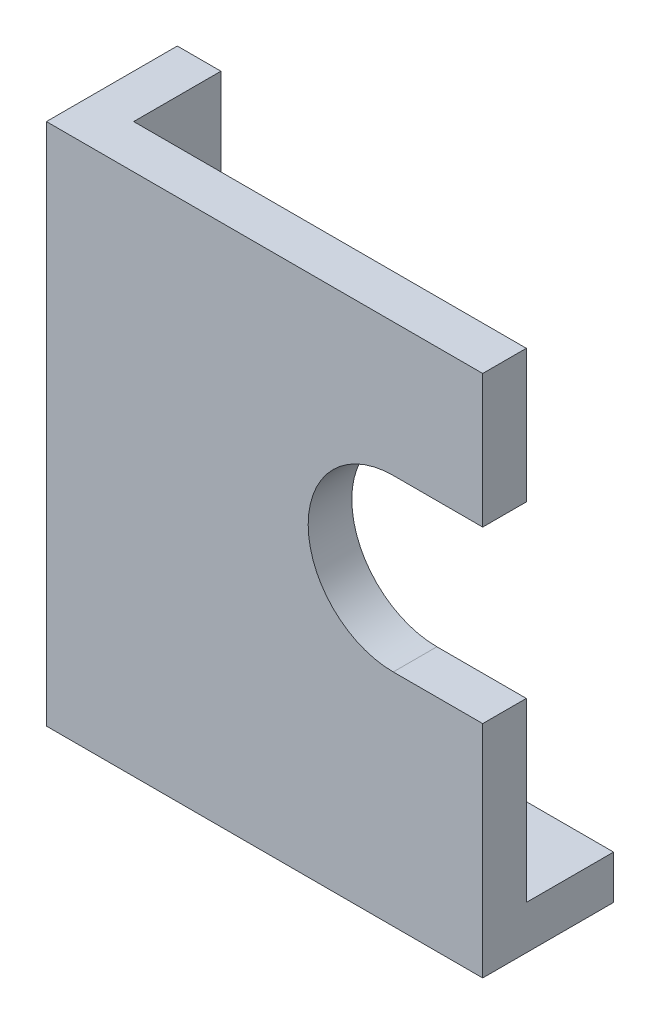
ISO-10303-21;
HEADER;
FILE_DESCRIPTION(('STEP AP214'),'2;1');
FILE_NAME('part.step','',(''),(''),'','','');
FILE_SCHEMA(('AUTOMOTIVE_DESIGN { 1 0 10303 214 1 1 1 1 }'));
ENDSEC;
DATA;
#1=APPLICATION_CONTEXT('core data for automotive mechanical design processes');
#2=APPLICATION_PROTOCOL_DEFINITION('international standard','automotive_design',2000,#1);
#3=PRODUCT_CONTEXT('',#1,'mechanical');
#4=PRODUCT('Part','Part','',(#3));
#5=PRODUCT_RELATED_PRODUCT_CATEGORY('part','',(#4));
#6=PRODUCT_DEFINITION_FORMATION('','',#4);
#7=PRODUCT_DEFINITION_CONTEXT('part definition',#1,'design');
#8=PRODUCT_DEFINITION('design','',#6,#7);
#9=PRODUCT_DEFINITION_SHAPE('','',#8);
#10=(LENGTH_UNIT() NAMED_UNIT(*) SI_UNIT(.MILLI.,.METRE.));
#11=(NAMED_UNIT(*) PLANE_ANGLE_UNIT() SI_UNIT($,.RADIAN.));
#12=(NAMED_UNIT(*) SI_UNIT($,.STERADIAN.) SOLID_ANGLE_UNIT());
#13=UNCERTAINTY_MEASURE_WITH_UNIT(LENGTH_MEASURE(1.E-05),#10,'distance_accuracy_value','');
#14=(GEOMETRIC_REPRESENTATION_CONTEXT(3) GLOBAL_UNCERTAINTY_ASSIGNED_CONTEXT((#13)) GLOBAL_UNIT_ASSIGNED_CONTEXT((#10,
#11,#12)) REPRESENTATION_CONTEXT('',''));
#15=CARTESIAN_POINT('',(0.,0.,0.));
#16=DIRECTION('',(0.,0.,1.));
#17=DIRECTION('',(1.,0.,0.));
#18=AXIS2_PLACEMENT_3D('',#15,#16,#17);
#19=CARTESIAN_POINT('',(60.,90.,-10.));
#20=DIRECTION('',(0.,0.,1.));
#21=DIRECTION('',(0.,-1.,0.));
#22=AXIS2_PLACEMENT_3D('',#19,#20,#21);
#23=PLANE('',#22);
#24=DIRECTION('',(0.,1.,0.));
#25=VECTOR('',#24,1.);
#26=CARTESIAN_POINT('',(55.,79.5,-10.));
#27=LINE('',#26,#25);
#28=CARTESIAN_POINT('',(55.,79.5,-10.));
#29=VERTEX_POINT('',#28);
#30=CARTESIAN_POINT('',(55.,110.,-10.));
#31=VERTEX_POINT('',#30);
#32=EDGE_CURVE('E52',#29,#31,#27,.T.);
#33=ORIENTED_EDGE('',*,*,#32,.F.);
#34=DIRECTION('',(1.,0.,0.));
#35=VECTOR('',#34,1.);
#36=CARTESIAN_POINT('',(34.5,79.5,-10.));
#37=LINE('',#36,#35);
#38=CARTESIAN_POINT('',(34.5,79.5,-10.));
#39=VERTEX_POINT('',#38);
#40=EDGE_CURVE('E193',#39,#29,#37,.T.);
#41=ORIENTED_EDGE('',*,*,#40,.F.);
#42=CARTESIAN_POINT('',(34.5,60.,-10.));
#43=DIRECTION('',(0.,0.,-1.));
#44=DIRECTION('',(0.,1.,0.));
#45=AXIS2_PLACEMENT_3D('',#42,#43,#44);
#46=CIRCLE('',#45,19.5);
#47=CARTESIAN_POINT('',(34.5,40.5,-10.));
#48=VERTEX_POINT('',#47);
#49=EDGE_CURVE('E180',#48,#39,#46,.T.);
#50=ORIENTED_EDGE('',*,*,#49,.F.);
#51=DIRECTION('',(-1.,0.,0.));
#52=VECTOR('',#51,1.);
#53=CARTESIAN_POINT('',(34.5,40.5,-10.));
#54=LINE('',#53,#52);
#55=CARTESIAN_POINT('',(55.,40.5,-10.));
#56=VERTEX_POINT('',#55);
#57=EDGE_CURVE('E185',#56,#48,#54,.T.);
#58=ORIENTED_EDGE('',*,*,#57,.F.);
#59=DIRECTION('',(0.,1.,0.));
#60=VECTOR('',#59,1.);
#61=CARTESIAN_POINT('',(55.,0.,-10.));
#62=LINE('',#61,#60);
#63=CARTESIAN_POINT('',(55.,0.,-10.));
#64=VERTEX_POINT('',#63);
#65=EDGE_CURVE('E60',#64,#56,#62,.T.);
#66=ORIENTED_EDGE('',*,*,#65,.F.);
#67=DIRECTION('',(-1.,0.,0.));
#68=VECTOR('',#67,1.);
#69=CARTESIAN_POINT('',(60.,0.,-10.));
#70=LINE('',#69,#68);
#71=CARTESIAN_POINT('',(-35.,0.,-10.));
#72=VERTEX_POINT('',#71);
#73=EDGE_CURVE('E45',#64,#72,#70,.T.);
#74=ORIENTED_EDGE('',*,*,#73,.T.);
#75=DIRECTION('',(0.,-1.,0.));
#76=VECTOR('',#75,1.);
#77=CARTESIAN_POINT('',(-35.,90.,-10.));
#78=LINE('',#77,#76);
#79=CARTESIAN_POINT('',(-35.,110.,-10.));
#80=VERTEX_POINT('',#79);
#81=EDGE_CURVE('E127',#80,#72,#78,.T.);
#82=ORIENTED_EDGE('',*,*,#81,.F.);
#83=DIRECTION('',(-1.,0.,0.));
#84=VECTOR('',#83,1.);
#85=CARTESIAN_POINT('',(60.,110.,-10.));
#86=LINE('',#85,#84);
#87=EDGE_CURVE('E170',#31,#80,#86,.T.);
#88=ORIENTED_EDGE('',*,*,#87,.F.);
#89=EDGE_LOOP('',(#33,#41,#50,#58,#66,#74,#82,#88));
#90=FACE_BOUND('',#89,.T.);
#91=ADVANCED_FACE('F37',(#90),#23,.F.);
#92=CARTESIAN_POINT('',(60.,-10.,0.));
#93=DIRECTION('',(0.,0.,-1.));
#94=DIRECTION('',(-1.,0.,0.));
#95=AXIS2_PLACEMENT_3D('',#92,#93,#94);
#96=PLANE('',#95);
#97=DIRECTION('',(0.,-1.,0.));
#98=VECTOR('',#97,1.);
#99=CARTESIAN_POINT('',(55.,110.,0.));
#100=LINE('',#99,#98);
#101=CARTESIAN_POINT('',(55.,110.,0.));
#102=VERTEX_POINT('',#101);
#103=CARTESIAN_POINT('',(55.,79.5,0.));
#104=VERTEX_POINT('',#103);
#105=EDGE_CURVE('E157',#102,#104,#100,.T.);
#106=ORIENTED_EDGE('',*,*,#105,.F.);
#107=DIRECTION('',(1.,0.,0.));
#108=VECTOR('',#107,1.);
#109=CARTESIAN_POINT('',(-45.,110.,0.));
#110=LINE('',#109,#108);
#111=CARTESIAN_POINT('',(-45.,110.,0.));
#112=VERTEX_POINT('',#111);
#113=EDGE_CURVE('E177',#112,#102,#110,.T.);
#114=ORIENTED_EDGE('',*,*,#113,.F.);
#115=DIRECTION('',(0.,1.,0.));
#116=VECTOR('',#115,1.);
#117=CARTESIAN_POINT('',(-45.,90.,0.));
#118=LINE('',#117,#116);
#119=CARTESIAN_POINT('',(-45.,-10.,0.));
#120=VERTEX_POINT('',#119);
#121=EDGE_CURVE('E204',#120,#112,#118,.T.);
#122=ORIENTED_EDGE('',*,*,#121,.F.);
#123=DIRECTION('',(-1.,0.,0.));
#124=VECTOR('',#123,1.);
#125=CARTESIAN_POINT('',(60.,-10.,0.));
#126=LINE('',#125,#124);
#127=CARTESIAN_POINT('',(55.,-10.,0.));
#128=VERTEX_POINT('',#127);
#129=EDGE_CURVE('E11',#128,#120,#126,.T.);
#130=ORIENTED_EDGE('',*,*,#129,.F.);
#131=DIRECTION('',(0.,-1.,0.));
#132=VECTOR('',#131,1.);
#133=CARTESIAN_POINT('',(55.,40.5,0.));
#134=LINE('',#133,#132);
#135=CARTESIAN_POINT('',(55.,40.5,0.));
#136=VERTEX_POINT('',#135);
#137=EDGE_CURVE('E166',#136,#128,#134,.T.);
#138=ORIENTED_EDGE('',*,*,#137,.F.);
#139=DIRECTION('',(-1.,0.,0.));
#140=VECTOR('',#139,1.);
#141=CARTESIAN_POINT('',(34.5,40.5,0.));
#142=LINE('',#141,#140);
#143=CARTESIAN_POINT('',(34.5,40.5,0.));
#144=VERTEX_POINT('',#143);
#145=EDGE_CURVE('E188',#136,#144,#142,.T.);
#146=ORIENTED_EDGE('',*,*,#145,.T.);
#147=CARTESIAN_POINT('',(34.5,60.,0.));
#148=DIRECTION('',(0.,0.,-1.));
#149=DIRECTION('',(0.,1.,0.));
#150=AXIS2_PLACEMENT_3D('',#147,#148,#149);
#151=CIRCLE('',#150,19.5);
#152=CARTESIAN_POINT('',(34.5,79.5,0.));
#153=VERTEX_POINT('',#152);
#154=EDGE_CURVE('E181',#144,#153,#151,.T.);
#155=ORIENTED_EDGE('',*,*,#154,.T.);
#156=DIRECTION('',(1.,0.,0.));
#157=VECTOR('',#156,1.);
#158=CARTESIAN_POINT('',(34.5,79.5,0.));
#159=LINE('',#158,#157);
#160=EDGE_CURVE('E184',#153,#104,#159,.T.);
#161=ORIENTED_EDGE('',*,*,#160,.T.);
#162=EDGE_LOOP('',(#106,#114,#122,#130,#138,#146,#155,#161));
#163=FACE_BOUND('',#162,.T.);
#164=ADVANCED_FACE('F39',(#163),#96,.F.);
#165=CARTESIAN_POINT('',(34.5,79.5,0.));
#166=DIRECTION('',(0.,1.,0.));
#167=DIRECTION('',(-1.,0.,0.));
#168=AXIS2_PLACEMENT_3D('',#165,#166,#167);
#169=PLANE('',#168);
#170=DIRECTION('',(0.,0.,-1.));
#171=VECTOR('',#170,1.);
#172=CARTESIAN_POINT('',(55.,79.5,0.));
#173=LINE('',#172,#171);
#174=EDGE_CURVE('E159',#104,#29,#173,.T.);
#175=ORIENTED_EDGE('',*,*,#174,.F.);
#176=ORIENTED_EDGE('',*,*,#160,.F.);
#177=DIRECTION('',(0.,0.,-1.));
#178=VECTOR('',#177,1.);
#179=CARTESIAN_POINT('',(34.5,79.5,0.));
#180=LINE('',#179,#178);
#181=EDGE_CURVE('E190',#153,#39,#180,.T.);
#182=ORIENTED_EDGE('',*,*,#181,.T.);
#183=ORIENTED_EDGE('',*,*,#40,.T.);
#184=EDGE_LOOP('',(#175,#176,#182,#183));
#185=FACE_BOUND('',#184,.T.);
#186=ADVANCED_FACE('F237',(#185),#169,.F.);
#187=CARTESIAN_POINT('',(0.,110.,0.));
#188=DIRECTION('',(0.,1.,0.));
#189=DIRECTION('',(0.,0.,1.));
#190=AXIS2_PLACEMENT_3D('',#187,#188,#189);
#191=PLANE('',#190);
#192=ORIENTED_EDGE('',*,*,#113,.T.);
#193=DIRECTION('',(0.,0.,1.));
#194=VECTOR('',#193,1.);
#195=CARTESIAN_POINT('',(55.,110.,-10.));
#196=LINE('',#195,#194);
#197=EDGE_CURVE('E155',#31,#102,#196,.T.);
#198=ORIENTED_EDGE('',*,*,#197,.F.);
#199=ORIENTED_EDGE('',*,*,#87,.T.);
#200=DIRECTION('',(0.,0.,-1.));
#201=VECTOR('',#200,1.);
#202=CARTESIAN_POINT('',(-35.,110.,-10.));
#203=LINE('',#202,#201);
#204=CARTESIAN_POINT('',(-35.,110.,-29.9999999999999));
#205=VERTEX_POINT('',#204);
#206=EDGE_CURVE('E172',#80,#205,#203,.T.);
#207=ORIENTED_EDGE('',*,*,#206,.T.);
#208=DIRECTION('',(1.,0.,0.));
#209=VECTOR('',#208,1.);
#210=CARTESIAN_POINT('',(-45.,110.,-29.9999999999999));
#211=LINE('',#210,#209);
#212=CARTESIAN_POINT('',(-45.,110.,-29.9999999999999));
#213=VERTEX_POINT('',#212);
#214=EDGE_CURVE('E145',#213,#205,#211,.T.);
#215=ORIENTED_EDGE('',*,*,#214,.F.);
#216=DIRECTION('',(0.,0.,1.));
#217=VECTOR('',#216,1.);
#218=CARTESIAN_POINT('',(-45.,110.,-25.));
#219=LINE('',#218,#217);
#220=EDGE_CURVE('E174',#213,#112,#219,.T.);
#221=ORIENTED_EDGE('',*,*,#220,.T.);
#222=EDGE_LOOP('',(#192,#198,#199,#207,#215,#221));
#223=FACE_BOUND('',#222,.T.);
#224=ADVANCED_FACE('F233',(#223),#191,.T.);
#225=CARTESIAN_POINT('',(60.,0.,-10.));
#226=DIRECTION('',(0.,-1.,0.));
#227=DIRECTION('',(0.,0.,-1.));
#228=AXIS2_PLACEMENT_3D('',#225,#226,#227);
#229=PLANE('',#228);
#230=ORIENTED_EDGE('',*,*,#73,.F.);
#231=DIRECTION('',(0.,0.,1.));
#232=VECTOR('',#231,1.);
#233=CARTESIAN_POINT('',(55.,0.,-25.));
#234=LINE('',#233,#232);
#235=CARTESIAN_POINT('',(55.,0.,-30.));
#236=VERTEX_POINT('',#235);
#237=EDGE_CURVE('E135',#236,#64,#234,.T.);
#238=ORIENTED_EDGE('',*,*,#237,.F.);
#239=DIRECTION('',(1.,0.,0.));
#240=VECTOR('',#239,1.);
#241=CARTESIAN_POINT('',(-35.,0.,-30.));
#242=LINE('',#241,#240);
#243=CARTESIAN_POINT('',(-35.,0.,-30.));
#244=VERTEX_POINT('',#243);
#245=EDGE_CURVE('E133',#244,#236,#242,.T.);
#246=ORIENTED_EDGE('',*,*,#245,.F.);
#247=DIRECTION('',(0.,0.,-1.));
#248=VECTOR('',#247,1.);
#249=CARTESIAN_POINT('',(-35.,0.,-25.));
#250=LINE('',#249,#248);
#251=EDGE_CURVE('E120',#72,#244,#250,.T.);
#252=ORIENTED_EDGE('',*,*,#251,.F.);
#253=EDGE_LOOP('',(#230,#238,#246,#252));
#254=FACE_BOUND('',#253,.T.);
#255=ADVANCED_FACE('F134',(#254),#229,.F.);
#256=CARTESIAN_POINT('',(60.,-10.,-25.));
#257=DIRECTION('',(0.,1.,0.));
#258=DIRECTION('',(0.,0.,1.));
#259=AXIS2_PLACEMENT_3D('',#256,#257,#258);
#260=PLANE('',#259);
#261=DIRECTION('',(0.,0.,1.));
#262=VECTOR('',#261,1.);
#263=CARTESIAN_POINT('',(-45.,-10.,0.));
#264=LINE('',#263,#262);
#265=CARTESIAN_POINT('',(-45.,-10.,-30.));
#266=VERTEX_POINT('',#265);
#267=EDGE_CURVE('E201',#266,#120,#264,.T.);
#268=ORIENTED_EDGE('',*,*,#267,.F.);
#269=DIRECTION('',(-1.,0.,0.));
#270=VECTOR('',#269,1.);
#271=CARTESIAN_POINT('',(55.,-10.,-30.));
#272=LINE('',#271,#270);
#273=CARTESIAN_POINT('',(55.,-10.,-30.));
#274=VERTEX_POINT('',#273);
#275=EDGE_CURVE('E149',#274,#266,#272,.T.);
#276=ORIENTED_EDGE('',*,*,#275,.F.);
#277=DIRECTION('',(0.,0.,-1.));
#278=VECTOR('',#277,1.);
#279=CARTESIAN_POINT('',(55.,-10.,0.));
#280=LINE('',#279,#278);
#281=EDGE_CURVE('E168',#128,#274,#280,.T.);
#282=ORIENTED_EDGE('',*,*,#281,.F.);
#283=ORIENTED_EDGE('',*,*,#129,.T.);
#284=EDGE_LOOP('',(#268,#276,#282,#283));
#285=FACE_BOUND('',#284,.T.);
#286=ADVANCED_FACE('F227',(#285),#260,.F.);
#287=CARTESIAN_POINT('',(-45.,0.,0.));
#288=DIRECTION('',(1.,0.,0.));
#289=DIRECTION('',(0.,0.,-1.));
#290=AXIS2_PLACEMENT_3D('',#287,#288,#289);
#291=PLANE('',#290);
#292=ORIENTED_EDGE('',*,*,#121,.T.);
#293=ORIENTED_EDGE('',*,*,#220,.F.);
#294=DIRECTION('',(0.,1.,0.));
#295=VECTOR('',#294,1.);
#296=CARTESIAN_POINT('',(-45.,-10.,-30.));
#297=LINE('',#296,#295);
#298=EDGE_CURVE('E152',#266,#213,#297,.T.);
#299=ORIENTED_EDGE('',*,*,#298,.F.);
#300=ORIENTED_EDGE('',*,*,#267,.T.);
#301=EDGE_LOOP('',(#292,#293,#299,#300));
#302=FACE_BOUND('',#301,.T.);
#303=ADVANCED_FACE('F230',(#302),#291,.F.);
#304=CARTESIAN_POINT('',(-35.,90.,-25.));
#305=DIRECTION('',(-1.,0.,0.));
#306=DIRECTION('',(0.,0.,1.));
#307=AXIS2_PLACEMENT_3D('',#304,#305,#306);
#308=PLANE('',#307);
#309=ORIENTED_EDGE('',*,*,#251,.T.);
#310=DIRECTION('',(0.,-1.,0.));
#311=VECTOR('',#310,1.);
#312=CARTESIAN_POINT('',(-35.,110.,-29.9999999999999));
#313=LINE('',#312,#311);
#314=EDGE_CURVE('E125',#205,#244,#313,.T.);
#315=ORIENTED_EDGE('',*,*,#314,.F.);
#316=ORIENTED_EDGE('',*,*,#206,.F.);
#317=ORIENTED_EDGE('',*,*,#81,.T.);
#318=EDGE_LOOP('',(#309,#315,#316,#317));
#319=FACE_BOUND('',#318,.T.);
#320=ADVANCED_FACE('F122',(#319),#308,.F.);
#321=CARTESIAN_POINT('',(34.5,60.,0.));
#322=DIRECTION('',(0.,0.,-1.));
#323=DIRECTION('',(0.,1.,0.));
#324=AXIS2_PLACEMENT_3D('',#321,#322,#323);
#325=CYLINDRICAL_SURFACE('',#324,19.5);
#326=ORIENTED_EDGE('',*,*,#49,.T.);
#327=ORIENTED_EDGE('',*,*,#181,.F.);
#328=ORIENTED_EDGE('',*,*,#154,.F.);
#329=DIRECTION('',(0.,0.,-1.));
#330=VECTOR('',#329,1.);
#331=CARTESIAN_POINT('',(34.5,40.5,0.));
#332=LINE('',#331,#330);
#333=EDGE_CURVE('E130',#144,#48,#332,.T.);
#334=ORIENTED_EDGE('',*,*,#333,.T.);
#335=EDGE_LOOP('',(#326,#327,#328,#334));
#336=FACE_BOUND('',#335,.T.);
#337=ADVANCED_FACE('F216',(#336),#325,.F.);
#338=CARTESIAN_POINT('',(34.5,40.5,0.));
#339=DIRECTION('',(0.,-1.,0.));
#340=DIRECTION('',(1.,0.,0.));
#341=AXIS2_PLACEMENT_3D('',#338,#339,#340);
#342=PLANE('',#341);
#343=ORIENTED_EDGE('',*,*,#145,.F.);
#344=DIRECTION('',(0.,0.,1.));
#345=VECTOR('',#344,1.);
#346=CARTESIAN_POINT('',(55.,40.5,-10.));
#347=LINE('',#346,#345);
#348=EDGE_CURVE('E164',#56,#136,#347,.T.);
#349=ORIENTED_EDGE('',*,*,#348,.F.);
#350=ORIENTED_EDGE('',*,*,#57,.T.);
#351=ORIENTED_EDGE('',*,*,#333,.F.);
#352=EDGE_LOOP('',(#343,#349,#350,#351));
#353=FACE_BOUND('',#352,.T.);
#354=ADVANCED_FACE('F213',(#353),#342,.F.);
#355=CARTESIAN_POINT('',(55.,0.,0.));
#356=DIRECTION('',(-1.,0.,0.));
#357=DIRECTION('',(0.,0.,1.));
#358=AXIS2_PLACEMENT_3D('',#355,#356,#357);
#359=PLANE('',#358);
#360=ORIENTED_EDGE('',*,*,#237,.T.);
#361=ORIENTED_EDGE('',*,*,#65,.T.);
#362=ORIENTED_EDGE('',*,*,#348,.T.);
#363=ORIENTED_EDGE('',*,*,#137,.T.);
#364=ORIENTED_EDGE('',*,*,#281,.T.);
#365=DIRECTION('',(0.,-1.,0.));
#366=VECTOR('',#365,1.);
#367=CARTESIAN_POINT('',(55.,0.,-30.));
#368=LINE('',#367,#366);
#369=EDGE_CURVE('E139',#236,#274,#368,.T.);
#370=ORIENTED_EDGE('',*,*,#369,.F.);
#371=EDGE_LOOP('',(#360,#361,#362,#363,#364,#370));
#372=FACE_BOUND('',#371,.T.);
#373=ADVANCED_FACE('F224',(#372),#359,.F.);
#374=CARTESIAN_POINT('',(55.,0.,0.));
#375=DIRECTION('',(1.,0.,0.));
#376=DIRECTION('',(0.,0.,-1.));
#377=AXIS2_PLACEMENT_3D('',#374,#375,#376);
#378=PLANE('',#377);
#379=ORIENTED_EDGE('',*,*,#197,.T.);
#380=ORIENTED_EDGE('',*,*,#105,.T.);
#381=ORIENTED_EDGE('',*,*,#174,.T.);
#382=ORIENTED_EDGE('',*,*,#32,.T.);
#383=EDGE_LOOP('',(#379,#380,#381,#382));
#384=FACE_BOUND('',#383,.T.);
#385=ADVANCED_FACE('F235',(#384),#378,.T.);
#386=CARTESIAN_POINT('',(0.,0.,-30.));
#387=DIRECTION('',(0.,0.,1.));
#388=DIRECTION('',(0.,-1.,0.));
#389=AXIS2_PLACEMENT_3D('',#386,#387,#388);
#390=PLANE('',#389);
#391=ORIENTED_EDGE('',*,*,#314,.T.);
#392=ORIENTED_EDGE('',*,*,#245,.T.);
#393=ORIENTED_EDGE('',*,*,#369,.T.);
#394=ORIENTED_EDGE('',*,*,#275,.T.);
#395=ORIENTED_EDGE('',*,*,#298,.T.);
#396=ORIENTED_EDGE('',*,*,#214,.T.);
#397=EDGE_LOOP('',(#391,#392,#393,#394,#395,#396));
#398=FACE_BOUND('',#397,.T.);
#399=ADVANCED_FACE('F142',(#398),#390,.F.);
#400=CLOSED_SHELL('',(#91,#164,#186,#224,#255,#286,#303,#320,#337,#354,#373,#385,#399));
#401=MANIFOLD_SOLID_BREP('B2',#400);
#402=ADVANCED_BREP_SHAPE_REPRESENTATION('',(#18,#401),#14);
#403=SHAPE_DEFINITION_REPRESENTATION(#9,#402);
ENDSEC;
END-ISO-10303-21;
